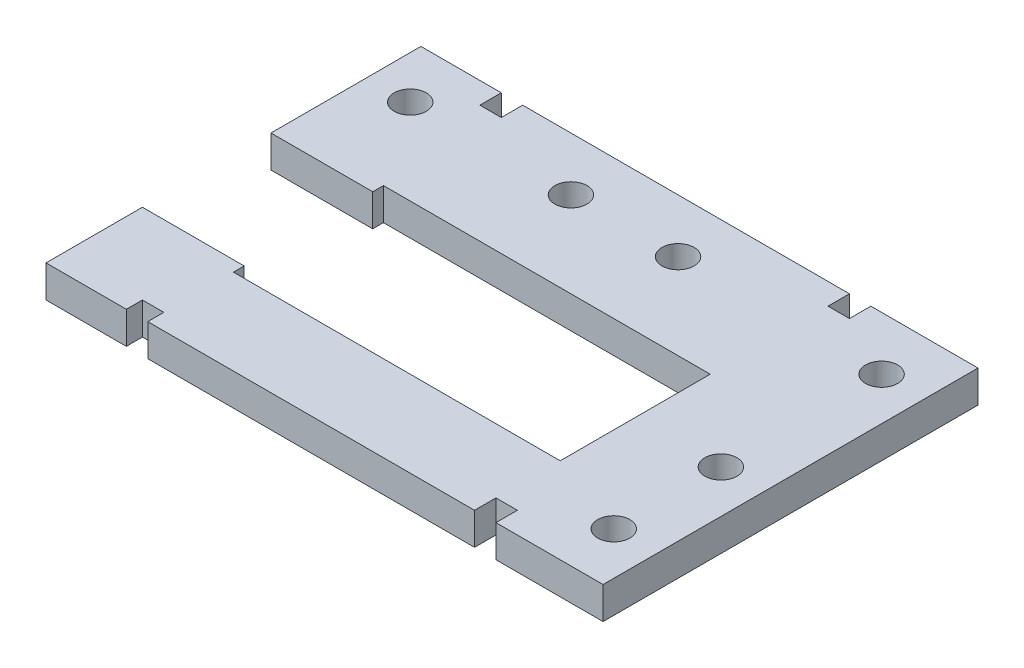
ISO-10303-21;
HEADER;
FILE_DESCRIPTION(('STEP AP214'),'2;1');
FILE_NAME('part.step','',(''),(''),'','','');
FILE_SCHEMA(('AUTOMOTIVE_DESIGN { 1 0 10303 214 1 1 1 1 }'));
ENDSEC;
DATA;
#1=APPLICATION_CONTEXT('core data for automotive mechanical design processes');
#2=APPLICATION_PROTOCOL_DEFINITION('international standard','automotive_design',2000,#1);
#3=PRODUCT_CONTEXT('',#1,'mechanical');
#4=PRODUCT('Part','Part','',(#3));
#5=PRODUCT_RELATED_PRODUCT_CATEGORY('part','',(#4));
#6=PRODUCT_DEFINITION_FORMATION('','',#4);
#7=PRODUCT_DEFINITION_CONTEXT('part definition',#1,'design');
#8=PRODUCT_DEFINITION('design','',#6,#7);
#9=PRODUCT_DEFINITION_SHAPE('','',#8);
#10=(LENGTH_UNIT() NAMED_UNIT(*) SI_UNIT(.MILLI.,.METRE.));
#11=(NAMED_UNIT(*) PLANE_ANGLE_UNIT() SI_UNIT($,.RADIAN.));
#12=(NAMED_UNIT(*) SI_UNIT($,.STERADIAN.) SOLID_ANGLE_UNIT());
#13=UNCERTAINTY_MEASURE_WITH_UNIT(LENGTH_MEASURE(1.E-05),#10,'distance_accuracy_value','');
#14=(GEOMETRIC_REPRESENTATION_CONTEXT(3) GLOBAL_UNCERTAINTY_ASSIGNED_CONTEXT((#13)) GLOBAL_UNIT_ASSIGNED_CONTEXT((#10,
#11,#12)) REPRESENTATION_CONTEXT('',''));
#15=CARTESIAN_POINT('',(0.,0.,0.));
#16=DIRECTION('',(0.,0.,1.));
#17=DIRECTION('',(1.,0.,0.));
#18=AXIS2_PLACEMENT_3D('',#15,#16,#17);
#19=CARTESIAN_POINT('',(0.,3.,-35.));
#20=DIRECTION('',(0.,0.,-1.));
#21=DIRECTION('',(-1.,0.,0.));
#22=AXIS2_PLACEMENT_3D('',#19,#20,#21);
#23=PLANE('',#22);
#24=DIRECTION('',(1.,0.,0.));
#25=VECTOR('',#24,1.);
#26=CARTESIAN_POINT('',(0.,0.,-35.));
#27=LINE('',#26,#25);
#28=CARTESIAN_POINT('',(42.,0.,-35.));
#29=VERTEX_POINT('',#28);
#30=CARTESIAN_POINT('',(52.,0.,-35.));
#31=VERTEX_POINT('',#30);
#32=EDGE_CURVE('E272',#29,#31,#27,.T.);
#33=ORIENTED_EDGE('',*,*,#32,.F.);
#34=DIRECTION('',(0.,-1.,0.));
#35=VECTOR('',#34,1.);
#36=CARTESIAN_POINT('',(42.,3.,-35.));
#37=LINE('',#36,#35);
#38=CARTESIAN_POINT('',(42.,3.,-35.));
#39=VERTEX_POINT('',#38);
#40=EDGE_CURVE('E11',#39,#29,#37,.T.);
#41=ORIENTED_EDGE('',*,*,#40,.F.);
#42=DIRECTION('',(1.,0.,0.));
#43=VECTOR('',#42,1.);
#44=CARTESIAN_POINT('',(0.,3.,-35.));
#45=LINE('',#44,#43);
#46=CARTESIAN_POINT('',(52.,3.,-35.));
#47=VERTEX_POINT('',#46);
#48=EDGE_CURVE('E418',#39,#47,#45,.T.);
#49=ORIENTED_EDGE('',*,*,#48,.T.);
#50=DIRECTION('',(0.,-1.,0.));
#51=VECTOR('',#50,1.);
#52=CARTESIAN_POINT('',(52.,3.,-35.));
#53=LINE('',#52,#51);
#54=EDGE_CURVE('E146',#47,#31,#53,.T.);
#55=ORIENTED_EDGE('',*,*,#54,.T.);
#56=EDGE_LOOP('',(#33,#41,#49,#55));
#57=FACE_BOUND('',#56,.T.);
#58=ADVANCED_FACE('F34',(#57),#23,.T.);
#59=CARTESIAN_POINT('',(42.,3.,0.));
#60=DIRECTION('',(1.,0.,0.));
#61=DIRECTION('',(0.,0.,-1.));
#62=AXIS2_PLACEMENT_3D('',#59,#60,#61);
#63=PLANE('',#62);
#64=DIRECTION('',(0.,0.,1.));
#65=VECTOR('',#64,1.);
#66=CARTESIAN_POINT('',(42.,0.,0.));
#67=LINE('',#66,#65);
#68=CARTESIAN_POINT('',(42.,0.,-33.));
#69=VERTEX_POINT('',#68);
#70=EDGE_CURVE('E274',#29,#69,#67,.T.);
#71=ORIENTED_EDGE('',*,*,#70,.T.);
#72=DIRECTION('',(0.,-1.,0.));
#73=VECTOR('',#72,1.);
#74=CARTESIAN_POINT('',(42.,3.,-33.));
#75=LINE('',#74,#73);
#76=CARTESIAN_POINT('',(42.,3.,-33.));
#77=VERTEX_POINT('',#76);
#78=EDGE_CURVE('E43',#77,#69,#75,.T.);
#79=ORIENTED_EDGE('',*,*,#78,.F.);
#80=DIRECTION('',(0.,0.,1.));
#81=VECTOR('',#80,1.);
#82=CARTESIAN_POINT('',(42.,3.,0.));
#83=LINE('',#82,#81);
#84=EDGE_CURVE('E414',#39,#77,#83,.T.);
#85=ORIENTED_EDGE('',*,*,#84,.F.);
#86=ORIENTED_EDGE('',*,*,#40,.T.);
#87=EDGE_LOOP('',(#71,#79,#85,#86));
#88=FACE_BOUND('',#87,.T.);
#89=ADVANCED_FACE('F401',(#88),#63,.F.);
#90=CARTESIAN_POINT('',(0.,3.,-33.));
#91=DIRECTION('',(0.,0.,-1.));
#92=DIRECTION('',(-1.,0.,0.));
#93=AXIS2_PLACEMENT_3D('',#90,#91,#92);
#94=PLANE('',#93);
#95=DIRECTION('',(1.,0.,0.));
#96=VECTOR('',#95,1.);
#97=CARTESIAN_POINT('',(0.,0.,-33.));
#98=LINE('',#97,#96);
#99=CARTESIAN_POINT('',(40.,0.,-33.));
#100=VERTEX_POINT('',#99);
#101=EDGE_CURVE('E279',#100,#69,#98,.T.);
#102=ORIENTED_EDGE('',*,*,#101,.F.);
#103=DIRECTION('',(0.,-1.,0.));
#104=VECTOR('',#103,1.);
#105=CARTESIAN_POINT('',(40.,3.,-33.));
#106=LINE('',#105,#104);
#107=CARTESIAN_POINT('',(40.,3.,-33.));
#108=VERTEX_POINT('',#107);
#109=EDGE_CURVE('E391',#108,#100,#106,.T.);
#110=ORIENTED_EDGE('',*,*,#109,.F.);
#111=DIRECTION('',(1.,0.,0.));
#112=VECTOR('',#111,1.);
#113=CARTESIAN_POINT('',(0.,3.,-33.));
#114=LINE('',#113,#112);
#115=EDGE_CURVE('E398',#108,#77,#114,.T.);
#116=ORIENTED_EDGE('',*,*,#115,.T.);
#117=ORIENTED_EDGE('',*,*,#78,.T.);
#118=EDGE_LOOP('',(#102,#110,#116,#117));
#119=FACE_BOUND('',#118,.T.);
#120=ADVANCED_FACE('F396',(#119),#94,.T.);
#121=CARTESIAN_POINT('',(40.,3.,0.));
#122=DIRECTION('',(1.,0.,0.));
#123=DIRECTION('',(0.,0.,-1.));
#124=AXIS2_PLACEMENT_3D('',#121,#122,#123);
#125=PLANE('',#124);
#126=DIRECTION('',(0.,0.,1.));
#127=VECTOR('',#126,1.);
#128=CARTESIAN_POINT('',(40.,0.,0.));
#129=LINE('',#128,#127);
#130=CARTESIAN_POINT('',(40.,0.,-35.));
#131=VERTEX_POINT('',#130);
#132=EDGE_CURVE('E282',#131,#100,#129,.T.);
#133=ORIENTED_EDGE('',*,*,#132,.F.);
#134=DIRECTION('',(0.,-1.,0.));
#135=VECTOR('',#134,1.);
#136=CARTESIAN_POINT('',(40.,3.,-35.));
#137=LINE('',#136,#135);
#138=CARTESIAN_POINT('',(40.,3.,-35.));
#139=VERTEX_POINT('',#138);
#140=EDGE_CURVE('E389',#139,#131,#137,.T.);
#141=ORIENTED_EDGE('',*,*,#140,.F.);
#142=DIRECTION('',(0.,0.,1.));
#143=VECTOR('',#142,1.);
#144=CARTESIAN_POINT('',(40.,3.,0.));
#145=LINE('',#144,#143);
#146=EDGE_CURVE('E411',#139,#108,#145,.T.);
#147=ORIENTED_EDGE('',*,*,#146,.T.);
#148=ORIENTED_EDGE('',*,*,#109,.T.);
#149=EDGE_LOOP('',(#133,#141,#147,#148));
#150=FACE_BOUND('',#149,.T.);
#151=ADVANCED_FACE('F408',(#150),#125,.T.);
#152=CARTESIAN_POINT('',(9.5,0.,-35.));
#153=VERTEX_POINT('',#152);
#154=EDGE_CURVE('E276',#153,#131,#27,.T.);
#155=ORIENTED_EDGE('',*,*,#154,.F.);
#156=DIRECTION('',(0.,-1.,0.));
#157=VECTOR('',#156,1.);
#158=CARTESIAN_POINT('',(9.5,3.,-35.));
#159=LINE('',#158,#157);
#160=CARTESIAN_POINT('',(9.5,3.,-35.));
#161=VERTEX_POINT('',#160);
#162=EDGE_CURVE('E387',#161,#153,#159,.T.);
#163=ORIENTED_EDGE('',*,*,#162,.F.);
#164=EDGE_CURVE('E416',#161,#139,#45,.T.);
#165=ORIENTED_EDGE('',*,*,#164,.T.);
#166=ORIENTED_EDGE('',*,*,#140,.T.);
#167=EDGE_LOOP('',(#155,#163,#165,#166));
#168=FACE_BOUND('',#167,.T.);
#169=ADVANCED_FACE('F544',(#168),#23,.T.);
#170=CARTESIAN_POINT('',(9.50000000000003,3.,0.));
#171=DIRECTION('',(1.,0.,0.));
#172=DIRECTION('',(0.,0.,-1.));
#173=AXIS2_PLACEMENT_3D('',#170,#171,#172);
#174=PLANE('',#173);
#175=DIRECTION('',(0.,0.,1.));
#176=VECTOR('',#175,1.);
#177=CARTESIAN_POINT('',(9.50000000000003,0.,0.));
#178=LINE('',#177,#176);
#179=CARTESIAN_POINT('',(9.5,0.,-33.));
#180=VERTEX_POINT('',#179);
#181=EDGE_CURVE('E285',#153,#180,#178,.T.);
#182=ORIENTED_EDGE('',*,*,#181,.T.);
#183=DIRECTION('',(0.,-1.,0.));
#184=VECTOR('',#183,1.);
#185=CARTESIAN_POINT('',(9.5,3.,-33.));
#186=LINE('',#185,#184);
#187=CARTESIAN_POINT('',(9.5,3.,-33.));
#188=VERTEX_POINT('',#187);
#189=EDGE_CURVE('E384',#188,#180,#186,.T.);
#190=ORIENTED_EDGE('',*,*,#189,.F.);
#191=DIRECTION('',(0.,0.,1.));
#192=VECTOR('',#191,1.);
#193=CARTESIAN_POINT('',(9.50000000000003,3.,0.));
#194=LINE('',#193,#192);
#195=EDGE_CURVE('E422',#161,#188,#194,.T.);
#196=ORIENTED_EDGE('',*,*,#195,.F.);
#197=ORIENTED_EDGE('',*,*,#162,.T.);
#198=EDGE_LOOP('',(#182,#190,#196,#197));
#199=FACE_BOUND('',#198,.T.);
#200=ADVANCED_FACE('F542',(#199),#174,.F.);
#201=CARTESIAN_POINT('',(0.,3.,-33.));
#202=DIRECTION('',(0.,0.,1.));
#203=DIRECTION('',(1.,0.,0.));
#204=AXIS2_PLACEMENT_3D('',#201,#202,#203);
#205=PLANE('',#204);
#206=DIRECTION('',(-1.,0.,0.));
#207=VECTOR('',#206,1.);
#208=CARTESIAN_POINT('',(0.,0.,-33.));
#209=LINE('',#208,#207);
#210=CARTESIAN_POINT('',(7.50000000000001,0.,-33.));
#211=VERTEX_POINT('',#210);
#212=EDGE_CURVE('E288',#180,#211,#209,.T.);
#213=ORIENTED_EDGE('',*,*,#212,.T.);
#214=DIRECTION('',(0.,-1.,0.));
#215=VECTOR('',#214,1.);
#216=CARTESIAN_POINT('',(7.50000000000001,3.,-33.));
#217=LINE('',#216,#215);
#218=CARTESIAN_POINT('',(7.50000000000001,3.,-33.));
#219=VERTEX_POINT('',#218);
#220=EDGE_CURVE('E382',#219,#211,#217,.T.);
#221=ORIENTED_EDGE('',*,*,#220,.F.);
#222=DIRECTION('',(-1.,0.,0.));
#223=VECTOR('',#222,1.);
#224=CARTESIAN_POINT('',(0.,3.,-33.));
#225=LINE('',#224,#223);
#226=EDGE_CURVE('E425',#188,#219,#225,.T.);
#227=ORIENTED_EDGE('',*,*,#226,.F.);
#228=ORIENTED_EDGE('',*,*,#189,.T.);
#229=EDGE_LOOP('',(#213,#221,#227,#228));
#230=FACE_BOUND('',#229,.T.);
#231=ADVANCED_FACE('F538',(#230),#205,.F.);
#232=CARTESIAN_POINT('',(7.50000000000002,3.,0.));
#233=DIRECTION('',(1.,0.,0.));
#234=DIRECTION('',(0.,0.,-1.));
#235=AXIS2_PLACEMENT_3D('',#232,#233,#234);
#236=PLANE('',#235);
#237=DIRECTION('',(0.,0.,1.));
#238=VECTOR('',#237,1.);
#239=CARTESIAN_POINT('',(7.50000000000002,0.,0.));
#240=LINE('',#239,#238);
#241=CARTESIAN_POINT('',(7.50000000000001,0.,-35.));
#242=VERTEX_POINT('',#241);
#243=EDGE_CURVE('E291',#242,#211,#240,.T.);
#244=ORIENTED_EDGE('',*,*,#243,.F.);
#245=DIRECTION('',(0.,-1.,0.));
#246=VECTOR('',#245,1.);
#247=CARTESIAN_POINT('',(7.50000000000001,3.,-35.));
#248=LINE('',#247,#246);
#249=CARTESIAN_POINT('',(7.50000000000001,3.,-35.));
#250=VERTEX_POINT('',#249);
#251=EDGE_CURVE('E380',#250,#242,#248,.T.);
#252=ORIENTED_EDGE('',*,*,#251,.F.);
#253=DIRECTION('',(0.,0.,1.));
#254=VECTOR('',#253,1.);
#255=CARTESIAN_POINT('',(7.50000000000002,3.,0.));
#256=LINE('',#255,#254);
#257=EDGE_CURVE('E427',#250,#219,#256,.T.);
#258=ORIENTED_EDGE('',*,*,#257,.T.);
#259=ORIENTED_EDGE('',*,*,#220,.T.);
#260=EDGE_LOOP('',(#244,#252,#258,#259));
#261=FACE_BOUND('',#260,.T.);
#262=ADVANCED_FACE('F534',(#261),#236,.T.);
#263=CARTESIAN_POINT('',(0.,0.,-35.));
#264=VERTEX_POINT('',#263);
#265=EDGE_CURVE('E275',#264,#242,#27,.T.);
#266=ORIENTED_EDGE('',*,*,#265,.F.);
#267=DIRECTION('',(0.,-1.,0.));
#268=VECTOR('',#267,1.);
#269=CARTESIAN_POINT('',(0.,3.,-35.));
#270=LINE('',#269,#268);
#271=CARTESIAN_POINT('',(0.,3.,-35.));
#272=VERTEX_POINT('',#271);
#273=EDGE_CURVE('E378',#272,#264,#270,.T.);
#274=ORIENTED_EDGE('',*,*,#273,.F.);
#275=EDGE_CURVE('E430',#272,#250,#45,.T.);
#276=ORIENTED_EDGE('',*,*,#275,.T.);
#277=ORIENTED_EDGE('',*,*,#251,.T.);
#278=EDGE_LOOP('',(#266,#274,#276,#277));
#279=FACE_BOUND('',#278,.T.);
#280=ADVANCED_FACE('F531',(#279),#23,.T.);
#281=CARTESIAN_POINT('',(0.,3.,0.));
#282=DIRECTION('',(-1.,0.,0.));
#283=DIRECTION('',(0.,0.,1.));
#284=AXIS2_PLACEMENT_3D('',#281,#282,#283);
#285=PLANE('',#284);
#286=DIRECTION('',(0.,0.,-1.));
#287=VECTOR('',#286,1.);
#288=CARTESIAN_POINT('',(0.,0.,0.));
#289=LINE('',#288,#287);
#290=CARTESIAN_POINT('',(0.,0.,-21.));
#291=VERTEX_POINT('',#290);
#292=EDGE_CURVE('E294',#291,#264,#289,.T.);
#293=ORIENTED_EDGE('',*,*,#292,.F.);
#294=DIRECTION('',(0.,-1.,0.));
#295=VECTOR('',#294,1.);
#296=CARTESIAN_POINT('',(0.,3.,-21.));
#297=LINE('',#296,#295);
#298=CARTESIAN_POINT('',(0.,3.,-21.));
#299=VERTEX_POINT('',#298);
#300=EDGE_CURVE('E376',#299,#291,#297,.T.);
#301=ORIENTED_EDGE('',*,*,#300,.F.);
#302=DIRECTION('',(0.,0.,-1.));
#303=VECTOR('',#302,1.);
#304=CARTESIAN_POINT('',(0.,3.,0.));
#305=LINE('',#304,#303);
#306=EDGE_CURVE('E431',#299,#272,#305,.T.);
#307=ORIENTED_EDGE('',*,*,#306,.T.);
#308=ORIENTED_EDGE('',*,*,#273,.T.);
#309=EDGE_LOOP('',(#293,#301,#307,#308));
#310=FACE_BOUND('',#309,.T.);
#311=ADVANCED_FACE('F524',(#310),#285,.T.);
#312=CARTESIAN_POINT('',(0.,3.,-21.));
#313=DIRECTION('',(0.,0.,-1.));
#314=DIRECTION('',(-1.,0.,0.));
#315=AXIS2_PLACEMENT_3D('',#312,#313,#314);
#316=PLANE('',#315);
#317=DIRECTION('',(1.,0.,0.));
#318=VECTOR('',#317,1.);
#319=CARTESIAN_POINT('',(0.,0.,-21.));
#320=LINE('',#319,#318);
#321=CARTESIAN_POINT('',(9.49999999999999,0.,-21.));
#322=VERTEX_POINT('',#321);
#323=EDGE_CURVE('E297',#291,#322,#320,.T.);
#324=ORIENTED_EDGE('',*,*,#323,.T.);
#325=DIRECTION('',(0.,-1.,0.));
#326=VECTOR('',#325,1.);
#327=CARTESIAN_POINT('',(9.49999999999999,3.,-21.));
#328=LINE('',#327,#326);
#329=CARTESIAN_POINT('',(9.49999999999999,3.,-21.));
#330=VERTEX_POINT('',#329);
#331=EDGE_CURVE('E374',#330,#322,#328,.T.);
#332=ORIENTED_EDGE('',*,*,#331,.F.);
#333=DIRECTION('',(1.,0.,0.));
#334=VECTOR('',#333,1.);
#335=CARTESIAN_POINT('',(0.,3.,-21.));
#336=LINE('',#335,#334);
#337=EDGE_CURVE('E434',#299,#330,#336,.T.);
#338=ORIENTED_EDGE('',*,*,#337,.F.);
#339=ORIENTED_EDGE('',*,*,#300,.T.);
#340=EDGE_LOOP('',(#324,#332,#338,#339));
#341=FACE_BOUND('',#340,.T.);
#342=ADVANCED_FACE('F547',(#341),#316,.F.);
#343=CARTESIAN_POINT('',(9.49999999999999,3.,0.));
#344=DIRECTION('',(1.,0.,0.));
#345=DIRECTION('',(0.,0.,-1.));
#346=AXIS2_PLACEMENT_3D('',#343,#344,#345);
#347=PLANE('',#346);
#348=DIRECTION('',(0.,0.,1.));
#349=VECTOR('',#348,1.);
#350=CARTESIAN_POINT('',(9.49999999999999,0.,0.));
#351=LINE('',#350,#349);
#352=CARTESIAN_POINT('',(9.49999999999999,0.,-22.));
#353=VERTEX_POINT('',#352);
#354=EDGE_CURVE('E301',#353,#322,#351,.T.);
#355=ORIENTED_EDGE('',*,*,#354,.F.);
#356=DIRECTION('',(0.,-1.,0.));
#357=VECTOR('',#356,1.);
#358=CARTESIAN_POINT('',(9.49999999999999,3.,-22.));
#359=LINE('',#358,#357);
#360=CARTESIAN_POINT('',(9.49999999999999,3.,-22.));
#361=VERTEX_POINT('',#360);
#362=EDGE_CURVE('E372',#361,#353,#359,.T.);
#363=ORIENTED_EDGE('',*,*,#362,.F.);
#364=DIRECTION('',(0.,0.,1.));
#365=VECTOR('',#364,1.);
#366=CARTESIAN_POINT('',(9.49999999999999,3.,0.));
#367=LINE('',#366,#365);
#368=EDGE_CURVE('E437',#361,#330,#367,.T.);
#369=ORIENTED_EDGE('',*,*,#368,.T.);
#370=ORIENTED_EDGE('',*,*,#331,.T.);
#371=EDGE_LOOP('',(#355,#363,#369,#370));
#372=FACE_BOUND('',#371,.T.);
#373=ADVANCED_FACE('F517',(#372),#347,.T.);
#374=CARTESIAN_POINT('',(0.,3.,-22.));
#375=DIRECTION('',(0.,0.,1.));
#376=DIRECTION('',(1.,0.,0.));
#377=AXIS2_PLACEMENT_3D('',#374,#375,#376);
#378=PLANE('',#377);
#379=DIRECTION('',(-1.,0.,0.));
#380=VECTOR('',#379,1.);
#381=CARTESIAN_POINT('',(0.,0.,-22.));
#382=LINE('',#381,#380);
#383=CARTESIAN_POINT('',(40.,0.,-22.));
#384=VERTEX_POINT('',#383);
#385=EDGE_CURVE('E304',#384,#353,#382,.T.);
#386=ORIENTED_EDGE('',*,*,#385,.F.);
#387=DIRECTION('',(0.,-1.,0.));
#388=VECTOR('',#387,1.);
#389=CARTESIAN_POINT('',(40.,3.,-22.));
#390=LINE('',#389,#388);
#391=CARTESIAN_POINT('',(40.,3.,-22.));
#392=VERTEX_POINT('',#391);
#393=EDGE_CURVE('E370',#392,#384,#390,.T.);
#394=ORIENTED_EDGE('',*,*,#393,.F.);
#395=DIRECTION('',(-1.,0.,0.));
#396=VECTOR('',#395,1.);
#397=CARTESIAN_POINT('',(0.,3.,-22.));
#398=LINE('',#397,#396);
#399=EDGE_CURVE('E440',#392,#361,#398,.T.);
#400=ORIENTED_EDGE('',*,*,#399,.T.);
#401=ORIENTED_EDGE('',*,*,#362,.T.);
#402=EDGE_LOOP('',(#386,#394,#400,#401));
#403=FACE_BOUND('',#402,.T.);
#404=ADVANCED_FACE('F511',(#403),#378,.T.);
#405=CARTESIAN_POINT('',(40.,3.,0.));
#406=DIRECTION('',(1.,0.,0.));
#407=DIRECTION('',(0.,0.,-1.));
#408=AXIS2_PLACEMENT_3D('',#405,#406,#407);
#409=PLANE('',#408);
#410=DIRECTION('',(0.,0.,1.));
#411=VECTOR('',#410,1.);
#412=CARTESIAN_POINT('',(40.,0.,0.));
#413=LINE('',#412,#411);
#414=CARTESIAN_POINT('',(40.,0.,-8.));
#415=VERTEX_POINT('',#414);
#416=EDGE_CURVE('E308',#384,#415,#413,.T.);
#417=ORIENTED_EDGE('',*,*,#416,.T.);
#418=DIRECTION('',(0.,-1.,0.));
#419=VECTOR('',#418,1.);
#420=CARTESIAN_POINT('',(40.,3.,-8.));
#421=LINE('',#420,#419);
#422=CARTESIAN_POINT('',(40.,3.,-8.));
#423=VERTEX_POINT('',#422);
#424=EDGE_CURVE('E367',#423,#415,#421,.T.);
#425=ORIENTED_EDGE('',*,*,#424,.F.);
#426=DIRECTION('',(0.,0.,1.));
#427=VECTOR('',#426,1.);
#428=CARTESIAN_POINT('',(40.,3.,0.));
#429=LINE('',#428,#427);
#430=EDGE_CURVE('E444',#392,#423,#429,.T.);
#431=ORIENTED_EDGE('',*,*,#430,.F.);
#432=ORIENTED_EDGE('',*,*,#393,.T.);
#433=EDGE_LOOP('',(#417,#425,#431,#432));
#434=FACE_BOUND('',#433,.T.);
#435=ADVANCED_FACE('F653',(#434),#409,.F.);
#436=CARTESIAN_POINT('',(0.,3.,-7.99999999999999));
#437=DIRECTION('',(0.,0.,1.));
#438=DIRECTION('',(1.,0.,0.));
#439=AXIS2_PLACEMENT_3D('',#436,#437,#438);
#440=PLANE('',#439);
#441=DIRECTION('',(-1.,0.,0.));
#442=VECTOR('',#441,1.);
#443=CARTESIAN_POINT('',(0.,0.,-7.99999999999999));
#444=LINE('',#443,#442);
#445=CARTESIAN_POINT('',(9.49999999999999,0.,-7.99999999999999));
#446=VERTEX_POINT('',#445);
#447=EDGE_CURVE('E311',#415,#446,#444,.T.);
#448=ORIENTED_EDGE('',*,*,#447,.T.);
#449=DIRECTION('',(0.,-1.,0.));
#450=VECTOR('',#449,1.);
#451=CARTESIAN_POINT('',(9.49999999999999,3.,-7.99999999999999));
#452=LINE('',#451,#450);
#453=CARTESIAN_POINT('',(9.49999999999999,3.,-7.99999999999999));
#454=VERTEX_POINT('',#453);
#455=EDGE_CURVE('E365',#454,#446,#452,.T.);
#456=ORIENTED_EDGE('',*,*,#455,.F.);
#457=DIRECTION('',(-1.,0.,0.));
#458=VECTOR('',#457,1.);
#459=CARTESIAN_POINT('',(0.,3.,-7.99999999999999));
#460=LINE('',#459,#458);
#461=EDGE_CURVE('E447',#423,#454,#460,.T.);
#462=ORIENTED_EDGE('',*,*,#461,.F.);
#463=ORIENTED_EDGE('',*,*,#424,.T.);
#464=EDGE_LOOP('',(#448,#456,#462,#463));
#465=FACE_BOUND('',#464,.T.);
#466=ADVANCED_FACE('F505',(#465),#440,.F.);
#467=CARTESIAN_POINT('',(9.49999999999999,0.,-9.));
#468=VERTEX_POINT('',#467);
#469=EDGE_CURVE('E305',#468,#446,#351,.T.);
#470=ORIENTED_EDGE('',*,*,#469,.F.);
#471=DIRECTION('',(0.,-1.,0.));
#472=VECTOR('',#471,1.);
#473=CARTESIAN_POINT('',(9.49999999999999,3.,-9.));
#474=LINE('',#473,#472);
#475=CARTESIAN_POINT('',(9.49999999999999,3.,-9.));
#476=VERTEX_POINT('',#475);
#477=EDGE_CURVE('E363',#476,#468,#474,.T.);
#478=ORIENTED_EDGE('',*,*,#477,.F.);
#479=EDGE_CURVE('E441',#476,#454,#367,.T.);
#480=ORIENTED_EDGE('',*,*,#479,.T.);
#481=ORIENTED_EDGE('',*,*,#455,.T.);
#482=EDGE_LOOP('',(#470,#478,#480,#481));
#483=FACE_BOUND('',#482,.T.);
#484=ADVANCED_FACE('F502',(#483),#347,.T.);
#485=CARTESIAN_POINT('',(0.,3.,-9.));
#486=DIRECTION('',(0.,0.,-1.));
#487=DIRECTION('',(-1.,0.,0.));
#488=AXIS2_PLACEMENT_3D('',#485,#486,#487);
#489=PLANE('',#488);
#490=DIRECTION('',(1.,0.,0.));
#491=VECTOR('',#490,1.);
#492=CARTESIAN_POINT('',(0.,0.,-9.));
#493=LINE('',#492,#491);
#494=CARTESIAN_POINT('',(0.,0.,-9.));
#495=VERTEX_POINT('',#494);
#496=EDGE_CURVE('E314',#495,#468,#493,.T.);
#497=ORIENTED_EDGE('',*,*,#496,.F.);
#498=DIRECTION('',(0.,-1.,0.));
#499=VECTOR('',#498,1.);
#500=CARTESIAN_POINT('',(0.,3.,-9.));
#501=LINE('',#500,#499);
#502=CARTESIAN_POINT('',(0.,3.,-9.));
#503=VERTEX_POINT('',#502);
#504=EDGE_CURVE('E361',#503,#495,#501,.T.);
#505=ORIENTED_EDGE('',*,*,#504,.F.);
#506=DIRECTION('',(1.,0.,0.));
#507=VECTOR('',#506,1.);
#508=CARTESIAN_POINT('',(0.,3.,-9.));
#509=LINE('',#508,#507);
#510=EDGE_CURVE('E449',#503,#476,#509,.T.);
#511=ORIENTED_EDGE('',*,*,#510,.T.);
#512=ORIENTED_EDGE('',*,*,#477,.T.);
#513=EDGE_LOOP('',(#497,#505,#511,#512));
#514=FACE_BOUND('',#513,.T.);
#515=ADVANCED_FACE('F497',(#514),#489,.T.);
#516=CARTESIAN_POINT('',(0.,0.,0.));
#517=VERTEX_POINT('',#516);
#518=EDGE_CURVE('E298',#517,#495,#289,.T.);
#519=ORIENTED_EDGE('',*,*,#518,.F.);
#520=DIRECTION('',(0.,-1.,0.));
#521=VECTOR('',#520,1.);
#522=CARTESIAN_POINT('',(0.,3.,0.));
#523=LINE('',#522,#521);
#524=CARTESIAN_POINT('',(0.,3.,0.));
#525=VERTEX_POINT('',#524);
#526=EDGE_CURVE('E359',#525,#517,#523,.T.);
#527=ORIENTED_EDGE('',*,*,#526,.F.);
#528=EDGE_CURVE('E435',#525,#503,#305,.T.);
#529=ORIENTED_EDGE('',*,*,#528,.T.);
#530=ORIENTED_EDGE('',*,*,#504,.T.);
#531=EDGE_LOOP('',(#519,#527,#529,#530));
#532=FACE_BOUND('',#531,.T.);
#533=ADVANCED_FACE('F492',(#532),#285,.T.);
#534=CARTESIAN_POINT('',(0.,3.,0.));
#535=DIRECTION('',(0.,0.,-1.));
#536=DIRECTION('',(-1.,0.,0.));
#537=AXIS2_PLACEMENT_3D('',#534,#535,#536);
#538=PLANE('',#537);
#539=DIRECTION('',(1.,0.,0.));
#540=VECTOR('',#539,1.);
#541=CARTESIAN_POINT('',(0.,0.,0.));
#542=LINE('',#541,#540);
#543=CARTESIAN_POINT('',(7.50000000000001,0.,0.));
#544=VERTEX_POINT('',#543);
#545=EDGE_CURVE('E317',#517,#544,#542,.T.);
#546=ORIENTED_EDGE('',*,*,#545,.T.);
#547=DIRECTION('',(0.,-1.,0.));
#548=VECTOR('',#547,1.);
#549=CARTESIAN_POINT('',(7.50000000000001,3.,0.));
#550=LINE('',#549,#548);
#551=CARTESIAN_POINT('',(7.50000000000001,3.,0.));
#552=VERTEX_POINT('',#551);
#553=EDGE_CURVE('E356',#552,#544,#550,.T.);
#554=ORIENTED_EDGE('',*,*,#553,.F.);
#555=DIRECTION('',(1.,0.,0.));
#556=VECTOR('',#555,1.);
#557=CARTESIAN_POINT('',(0.,3.,0.));
#558=LINE('',#557,#556);
#559=EDGE_CURVE('E243',#525,#552,#558,.T.);
#560=ORIENTED_EDGE('',*,*,#559,.F.);
#561=ORIENTED_EDGE('',*,*,#526,.T.);
#562=EDGE_LOOP('',(#546,#554,#560,#561));
#563=FACE_BOUND('',#562,.T.);
#564=ADVANCED_FACE('F488',(#563),#538,.F.);
#565=CARTESIAN_POINT('',(7.50000000000001,3.,0.));
#566=DIRECTION('',(-1.,0.,0.));
#567=DIRECTION('',(0.,0.,1.));
#568=AXIS2_PLACEMENT_3D('',#565,#566,#567);
#569=PLANE('',#568);
#570=DIRECTION('',(0.,0.,-1.));
#571=VECTOR('',#570,1.);
#572=CARTESIAN_POINT('',(7.50000000000001,0.,0.));
#573=LINE('',#572,#571);
#574=CARTESIAN_POINT('',(7.50000000000001,0.,-1.5));
#575=VERTEX_POINT('',#574);
#576=EDGE_CURVE('E320',#544,#575,#573,.T.);
#577=ORIENTED_EDGE('',*,*,#576,.T.);
#578=DIRECTION('',(0.,-1.,0.));
#579=VECTOR('',#578,1.);
#580=CARTESIAN_POINT('',(7.50000000000001,3.,-1.5));
#581=LINE('',#580,#579);
#582=CARTESIAN_POINT('',(7.50000000000001,3.,-1.5));
#583=VERTEX_POINT('',#582);
#584=EDGE_CURVE('E353',#583,#575,#581,.T.);
#585=ORIENTED_EDGE('',*,*,#584,.F.);
#586=DIRECTION('',(0.,0.,-1.));
#587=VECTOR('',#586,1.);
#588=CARTESIAN_POINT('',(7.50000000000001,3.,0.));
#589=LINE('',#588,#587);
#590=EDGE_CURVE('E453',#552,#583,#589,.T.);
#591=ORIENTED_EDGE('',*,*,#590,.F.);
#592=ORIENTED_EDGE('',*,*,#553,.T.);
#593=EDGE_LOOP('',(#577,#585,#591,#592));
#594=FACE_BOUND('',#593,.T.);
#595=ADVANCED_FACE('F485',(#594),#569,.F.);
#596=CARTESIAN_POINT('',(0.,3.,-1.5));
#597=DIRECTION('',(0.,0.,-1.));
#598=DIRECTION('',(-1.,0.,0.));
#599=AXIS2_PLACEMENT_3D('',#596,#597,#598);
#600=PLANE('',#599);
#601=DIRECTION('',(1.,0.,0.));
#602=VECTOR('',#601,1.);
#603=CARTESIAN_POINT('',(0.,0.,-1.5));
#604=LINE('',#603,#602);
#605=CARTESIAN_POINT('',(9.50000000000001,0.,-1.5));
#606=VERTEX_POINT('',#605);
#607=EDGE_CURVE('E325',#575,#606,#604,.T.);
#608=ORIENTED_EDGE('',*,*,#607,.T.);
#609=DIRECTION('',(0.,-1.,0.));
#610=VECTOR('',#609,1.);
#611=CARTESIAN_POINT('',(9.50000000000001,3.,-1.5));
#612=LINE('',#611,#610);
#613=CARTESIAN_POINT('',(9.50000000000001,3.,-1.5));
#614=VERTEX_POINT('',#613);
#615=EDGE_CURVE('E351',#614,#606,#612,.T.);
#616=ORIENTED_EDGE('',*,*,#615,.F.);
#617=DIRECTION('',(1.,0.,0.));
#618=VECTOR('',#617,1.);
#619=CARTESIAN_POINT('',(0.,3.,-1.5));
#620=LINE('',#619,#618);
#621=EDGE_CURVE('E456',#583,#614,#620,.T.);
#622=ORIENTED_EDGE('',*,*,#621,.F.);
#623=ORIENTED_EDGE('',*,*,#584,.T.);
#624=EDGE_LOOP('',(#608,#616,#622,#623));
#625=FACE_BOUND('',#624,.T.);
#626=ADVANCED_FACE('F478',(#625),#600,.F.);
#627=CARTESIAN_POINT('',(9.50000000000001,3.,0.));
#628=DIRECTION('',(-1.,0.,0.));
#629=DIRECTION('',(0.,0.,1.));
#630=AXIS2_PLACEMENT_3D('',#627,#628,#629);
#631=PLANE('',#630);
#632=DIRECTION('',(0.,0.,-1.));
#633=VECTOR('',#632,1.);
#634=CARTESIAN_POINT('',(9.50000000000001,0.,0.));
#635=LINE('',#634,#633);
#636=CARTESIAN_POINT('',(9.50000000000001,0.,0.));
#637=VERTEX_POINT('',#636);
#638=EDGE_CURVE('E328',#637,#606,#635,.T.);
#639=ORIENTED_EDGE('',*,*,#638,.F.);
#640=DIRECTION('',(0.,-1.,0.));
#641=VECTOR('',#640,1.);
#642=CARTESIAN_POINT('',(9.50000000000001,3.,0.));
#643=LINE('',#642,#641);
#644=CARTESIAN_POINT('',(9.50000000000001,3.,0.));
#645=VERTEX_POINT('',#644);
#646=EDGE_CURVE('E349',#645,#637,#643,.T.);
#647=ORIENTED_EDGE('',*,*,#646,.F.);
#648=DIRECTION('',(0.,0.,-1.));
#649=VECTOR('',#648,1.);
#650=CARTESIAN_POINT('',(9.50000000000001,3.,0.));
#651=LINE('',#650,#649);
#652=EDGE_CURVE('E458',#645,#614,#651,.T.);
#653=ORIENTED_EDGE('',*,*,#652,.T.);
#654=ORIENTED_EDGE('',*,*,#615,.T.);
#655=EDGE_LOOP('',(#639,#647,#653,#654));
#656=FACE_BOUND('',#655,.T.);
#657=ADVANCED_FACE('F475',(#656),#631,.T.);
#658=CARTESIAN_POINT('',(40.,0.,0.));
#659=VERTEX_POINT('',#658);
#660=EDGE_CURVE('E322',#637,#659,#542,.T.);
#661=ORIENTED_EDGE('',*,*,#660,.T.);
#662=DIRECTION('',(0.,-1.,0.));
#663=VECTOR('',#662,1.);
#664=CARTESIAN_POINT('',(40.,3.,0.));
#665=LINE('',#664,#663);
#666=CARTESIAN_POINT('',(40.,3.,0.));
#667=VERTEX_POINT('',#666);
#668=EDGE_CURVE('E346',#667,#659,#665,.T.);
#669=ORIENTED_EDGE('',*,*,#668,.F.);
#670=EDGE_CURVE('E242',#645,#667,#558,.T.);
#671=ORIENTED_EDGE('',*,*,#670,.F.);
#672=ORIENTED_EDGE('',*,*,#646,.T.);
#673=EDGE_LOOP('',(#661,#669,#671,#672));
#674=FACE_BOUND('',#673,.T.);
#675=ADVANCED_FACE('F467',(#674),#538,.F.);
#676=CARTESIAN_POINT('',(40.,3.,0.));
#677=DIRECTION('',(-1.,0.,0.));
#678=DIRECTION('',(0.,0.,1.));
#679=AXIS2_PLACEMENT_3D('',#676,#677,#678);
#680=PLANE('',#679);
#681=DIRECTION('',(0.,0.,-1.));
#682=VECTOR('',#681,1.);
#683=CARTESIAN_POINT('',(40.,0.,0.));
#684=LINE('',#683,#682);
#685=CARTESIAN_POINT('',(40.,0.,-2.));
#686=VERTEX_POINT('',#685);
#687=EDGE_CURVE('E331',#659,#686,#684,.T.);
#688=ORIENTED_EDGE('',*,*,#687,.T.);
#689=DIRECTION('',(0.,-1.,0.));
#690=VECTOR('',#689,1.);
#691=CARTESIAN_POINT('',(40.,3.,-2.));
#692=LINE('',#691,#690);
#693=CARTESIAN_POINT('',(40.,3.,-2.));
#694=VERTEX_POINT('',#693);
#695=EDGE_CURVE('E343',#694,#686,#692,.T.);
#696=ORIENTED_EDGE('',*,*,#695,.F.);
#697=DIRECTION('',(0.,0.,-1.));
#698=VECTOR('',#697,1.);
#699=CARTESIAN_POINT('',(40.,3.,0.));
#700=LINE('',#699,#698);
#701=EDGE_CURVE('E249',#667,#694,#700,.T.);
#702=ORIENTED_EDGE('',*,*,#701,.F.);
#703=ORIENTED_EDGE('',*,*,#668,.T.);
#704=EDGE_LOOP('',(#688,#696,#702,#703));
#705=FACE_BOUND('',#704,.T.);
#706=ADVANCED_FACE('F470',(#705),#680,.F.);
#707=CARTESIAN_POINT('',(0.,3.,-2.));
#708=DIRECTION('',(0.,0.,-1.));
#709=DIRECTION('',(-1.,0.,0.));
#710=AXIS2_PLACEMENT_3D('',#707,#708,#709);
#711=PLANE('',#710);
#712=DIRECTION('',(1.,0.,0.));
#713=VECTOR('',#712,1.);
#714=CARTESIAN_POINT('',(0.,0.,-2.));
#715=LINE('',#714,#713);
#716=CARTESIAN_POINT('',(42.,0.,-2.));
#717=VERTEX_POINT('',#716);
#718=EDGE_CURVE('E334',#686,#717,#715,.T.);
#719=ORIENTED_EDGE('',*,*,#718,.T.);
#720=DIRECTION('',(0.,-1.,0.));
#721=VECTOR('',#720,1.);
#722=CARTESIAN_POINT('',(42.,3.,-2.));
#723=LINE('',#722,#721);
#724=CARTESIAN_POINT('',(42.,3.,-2.));
#725=VERTEX_POINT('',#724);
#726=EDGE_CURVE('E235',#725,#717,#723,.T.);
#727=ORIENTED_EDGE('',*,*,#726,.F.);
#728=DIRECTION('',(1.,0.,0.));
#729=VECTOR('',#728,1.);
#730=CARTESIAN_POINT('',(0.,3.,-2.));
#731=LINE('',#730,#729);
#732=EDGE_CURVE('E246',#694,#725,#731,.T.);
#733=ORIENTED_EDGE('',*,*,#732,.F.);
#734=ORIENTED_EDGE('',*,*,#695,.T.);
#735=EDGE_LOOP('',(#719,#727,#733,#734));
#736=FACE_BOUND('',#735,.T.);
#737=ADVANCED_FACE('F472',(#736),#711,.F.);
#738=CARTESIAN_POINT('',(42.,3.,0.));
#739=DIRECTION('',(-1.,0.,0.));
#740=DIRECTION('',(0.,0.,1.));
#741=AXIS2_PLACEMENT_3D('',#738,#739,#740);
#742=PLANE('',#741);
#743=DIRECTION('',(0.,0.,-1.));
#744=VECTOR('',#743,1.);
#745=CARTESIAN_POINT('',(42.,0.,0.));
#746=LINE('',#745,#744);
#747=CARTESIAN_POINT('',(42.,0.,0.));
#748=VERTEX_POINT('',#747);
#749=EDGE_CURVE('E232',#748,#717,#746,.T.);
#750=ORIENTED_EDGE('',*,*,#749,.F.);
#751=DIRECTION('',(0.,-1.,0.));
#752=VECTOR('',#751,1.);
#753=CARTESIAN_POINT('',(42.,3.,0.));
#754=LINE('',#753,#752);
#755=CARTESIAN_POINT('',(42.,3.,0.));
#756=VERTEX_POINT('',#755);
#757=EDGE_CURVE('E226',#756,#748,#754,.T.);
#758=ORIENTED_EDGE('',*,*,#757,.F.);
#759=DIRECTION('',(0.,0.,-1.));
#760=VECTOR('',#759,1.);
#761=CARTESIAN_POINT('',(42.,3.,0.));
#762=LINE('',#761,#760);
#763=EDGE_CURVE('E230',#756,#725,#762,.T.);
#764=ORIENTED_EDGE('',*,*,#763,.T.);
#765=ORIENTED_EDGE('',*,*,#726,.T.);
#766=EDGE_LOOP('',(#750,#758,#764,#765));
#767=FACE_BOUND('',#766,.T.);
#768=ADVANCED_FACE('F228',(#767),#742,.T.);
#769=CARTESIAN_POINT('',(52.,0.,0.));
#770=VERTEX_POINT('',#769);
#771=EDGE_CURVE('E321',#748,#770,#542,.T.);
#772=ORIENTED_EDGE('',*,*,#771,.T.);
#773=DIRECTION('',(0.,-1.,0.));
#774=VECTOR('',#773,1.);
#775=CARTESIAN_POINT('',(52.,3.,0.));
#776=LINE('',#775,#774);
#777=CARTESIAN_POINT('',(52.,3.,0.));
#778=VERTEX_POINT('',#777);
#779=EDGE_CURVE('E236',#778,#770,#776,.T.);
#780=ORIENTED_EDGE('',*,*,#779,.F.);
#781=EDGE_CURVE('E239',#756,#778,#558,.T.);
#782=ORIENTED_EDGE('',*,*,#781,.F.);
#783=ORIENTED_EDGE('',*,*,#757,.T.);
#784=EDGE_LOOP('',(#772,#780,#782,#783));
#785=FACE_BOUND('',#784,.T.);
#786=ADVANCED_FACE('F240',(#785),#538,.F.);
#787=CARTESIAN_POINT('',(4.,3.,-30.));
#788=DIRECTION('',(0.,-1.,0.));
#789=DIRECTION('',(0.,0.,-1.));
#790=AXIS2_PLACEMENT_3D('',#787,#788,#789);
#791=CYLINDRICAL_SURFACE('',#790,1.5);
#792=CARTESIAN_POINT('',(4.,3.,-30.));
#793=DIRECTION('',(0.,1.,0.));
#794=DIRECTION('',(0.,0.,1.));
#795=AXIS2_PLACEMENT_3D('',#792,#793,#794);
#796=CIRCLE('',#795,1.5);
#797=CARTESIAN_POINT('',(4.,3.,-28.5));
#798=VERTEX_POINT('',#797);
#799=EDGE_CURVE('E546',#798,#798,#796,.T.);
#800=ORIENTED_EDGE('',*,*,#799,.T.);
#801=EDGE_LOOP('',(#800));
#802=FACE_BOUND('',#801,.T.);
#803=CARTESIAN_POINT('',(4.,0.,-30.));
#804=DIRECTION('',(0.,1.,0.));
#805=DIRECTION('',(0.,0.,1.));
#806=AXIS2_PLACEMENT_3D('',#803,#804,#805);
#807=CIRCLE('',#806,1.5);
#808=CARTESIAN_POINT('',(4.,0.,-28.5));
#809=VERTEX_POINT('',#808);
#810=EDGE_CURVE('E269',#809,#809,#807,.T.);
#811=ORIENTED_EDGE('',*,*,#810,.F.);
#812=EDGE_LOOP('',(#811));
#813=FACE_BOUND('',#812,.T.);
#814=ADVANCED_FACE('F580',(#802,#813),#791,.F.);
#815=CARTESIAN_POINT('',(48.,3.,-30.));
#816=DIRECTION('',(0.,-1.,0.));
#817=DIRECTION('',(0.,0.,-1.));
#818=AXIS2_PLACEMENT_3D('',#815,#816,#817);
#819=CYLINDRICAL_SURFACE('',#818,1.5);
#820=CARTESIAN_POINT('',(48.,3.,-30.));
#821=DIRECTION('',(0.,1.,0.));
#822=DIRECTION('',(0.,0.,1.));
#823=AXIS2_PLACEMENT_3D('',#820,#821,#822);
#824=CIRCLE('',#823,1.5);
#825=CARTESIAN_POINT('',(48.,3.,-28.5));
#826=VERTEX_POINT('',#825);
#827=EDGE_CURVE('E879',#826,#826,#824,.T.);
#828=ORIENTED_EDGE('',*,*,#827,.T.);
#829=EDGE_LOOP('',(#828));
#830=FACE_BOUND('',#829,.T.);
#831=CARTESIAN_POINT('',(48.,0.,-30.));
#832=DIRECTION('',(0.,1.,0.));
#833=DIRECTION('',(0.,0.,1.));
#834=AXIS2_PLACEMENT_3D('',#831,#832,#833);
#835=CIRCLE('',#834,1.5);
#836=CARTESIAN_POINT('',(48.,0.,-28.5));
#837=VERTEX_POINT('',#836);
#838=EDGE_CURVE('E266',#837,#837,#835,.T.);
#839=ORIENTED_EDGE('',*,*,#838,.F.);
#840=EDGE_LOOP('',(#839));
#841=FACE_BOUND('',#840,.T.);
#842=ADVANCED_FACE('F583',(#830,#841),#819,.F.);
#843=CARTESIAN_POINT('',(19.,3.,-30.));
#844=DIRECTION('',(0.,-1.,0.));
#845=DIRECTION('',(0.,0.,-1.));
#846=AXIS2_PLACEMENT_3D('',#843,#844,#845);
#847=CYLINDRICAL_SURFACE('',#846,1.5);
#848=CARTESIAN_POINT('',(19.,3.,-30.));
#849=DIRECTION('',(0.,1.,0.));
#850=DIRECTION('',(0.,0.,1.));
#851=AXIS2_PLACEMENT_3D('',#848,#849,#850);
#852=CIRCLE('',#851,1.5);
#853=CARTESIAN_POINT('',(19.,3.,-28.5));
#854=VERTEX_POINT('',#853);
#855=EDGE_CURVE('E875',#854,#854,#852,.T.);
#856=ORIENTED_EDGE('',*,*,#855,.T.);
#857=EDGE_LOOP('',(#856));
#858=FACE_BOUND('',#857,.T.);
#859=CARTESIAN_POINT('',(19.,0.,-30.));
#860=DIRECTION('',(0.,1.,0.));
#861=DIRECTION('',(0.,0.,1.));
#862=AXIS2_PLACEMENT_3D('',#859,#860,#861);
#863=CIRCLE('',#862,1.5);
#864=CARTESIAN_POINT('',(19.,0.,-28.5));
#865=VERTEX_POINT('',#864);
#866=EDGE_CURVE('E263',#865,#865,#863,.T.);
#867=ORIENTED_EDGE('',*,*,#866,.F.);
#868=EDGE_LOOP('',(#867));
#869=FACE_BOUND('',#868,.T.);
#870=ADVANCED_FACE('F587',(#858,#869),#847,.F.);
#871=CARTESIAN_POINT('',(29.,3.,-30.));
#872=DIRECTION('',(0.,-1.,0.));
#873=DIRECTION('',(0.,0.,-1.));
#874=AXIS2_PLACEMENT_3D('',#871,#872,#873);
#875=CYLINDRICAL_SURFACE('',#874,1.5);
#876=CARTESIAN_POINT('',(29.,3.,-30.));
#877=DIRECTION('',(0.,1.,0.));
#878=DIRECTION('',(0.,0.,1.));
#879=AXIS2_PLACEMENT_3D('',#876,#877,#878);
#880=CIRCLE('',#879,1.5);
#881=CARTESIAN_POINT('',(29.,3.,-28.5));
#882=VERTEX_POINT('',#881);
#883=EDGE_CURVE('E871',#882,#882,#880,.T.);
#884=ORIENTED_EDGE('',*,*,#883,.T.);
#885=EDGE_LOOP('',(#884));
#886=FACE_BOUND('',#885,.T.);
#887=CARTESIAN_POINT('',(29.,0.,-30.));
#888=DIRECTION('',(0.,1.,0.));
#889=DIRECTION('',(0.,0.,1.));
#890=AXIS2_PLACEMENT_3D('',#887,#888,#889);
#891=CIRCLE('',#890,1.5);
#892=CARTESIAN_POINT('',(29.,0.,-28.5));
#893=VERTEX_POINT('',#892);
#894=EDGE_CURVE('E260',#893,#893,#891,.T.);
#895=ORIENTED_EDGE('',*,*,#894,.F.);
#896=EDGE_LOOP('',(#895));
#897=FACE_BOUND('',#896,.T.);
#898=ADVANCED_FACE('F591',(#886,#897),#875,.F.);
#899=CARTESIAN_POINT('',(48.,3.,-15.));
#900=DIRECTION('',(0.,-1.,0.));
#901=DIRECTION('',(0.,0.,-1.));
#902=AXIS2_PLACEMENT_3D('',#899,#900,#901);
#903=CYLINDRICAL_SURFACE('',#902,1.5);
#904=CARTESIAN_POINT('',(48.,3.,-15.));
#905=DIRECTION('',(0.,1.,0.));
#906=DIRECTION('',(0.,0.,1.));
#907=AXIS2_PLACEMENT_3D('',#904,#905,#906);
#908=CIRCLE('',#907,1.5);
#909=CARTESIAN_POINT('',(48.,3.,-13.5));
#910=VERTEX_POINT('',#909);
#911=EDGE_CURVE('E606',#910,#910,#908,.T.);
#912=ORIENTED_EDGE('',*,*,#911,.T.);
#913=EDGE_LOOP('',(#912));
#914=FACE_BOUND('',#913,.T.);
#915=CARTESIAN_POINT('',(48.,0.,-15.));
#916=DIRECTION('',(0.,1.,0.));
#917=DIRECTION('',(0.,0.,1.));
#918=AXIS2_PLACEMENT_3D('',#915,#916,#917);
#919=CIRCLE('',#918,1.5);
#920=CARTESIAN_POINT('',(48.,0.,-13.5));
#921=VERTEX_POINT('',#920);
#922=EDGE_CURVE('E257',#921,#921,#919,.T.);
#923=ORIENTED_EDGE('',*,*,#922,.F.);
#924=EDGE_LOOP('',(#923));
#925=FACE_BOUND('',#924,.T.);
#926=ADVANCED_FACE('F594',(#914,#925),#903,.F.);
#927=CARTESIAN_POINT('',(48.,3.,-5.));
#928=DIRECTION('',(0.,-1.,0.));
#929=DIRECTION('',(0.,0.,-1.));
#930=AXIS2_PLACEMENT_3D('',#927,#928,#929);
#931=CYLINDRICAL_SURFACE('',#930,1.5);
#932=CARTESIAN_POINT('',(48.,3.,-5.));
#933=DIRECTION('',(0.,1.,0.));
#934=DIRECTION('',(0.,0.,1.));
#935=AXIS2_PLACEMENT_3D('',#932,#933,#934);
#936=CIRCLE('',#935,1.5);
#937=CARTESIAN_POINT('',(48.,3.,-3.5));
#938=VERTEX_POINT('',#937);
#939=EDGE_CURVE('E339',#938,#938,#936,.T.);
#940=ORIENTED_EDGE('',*,*,#939,.T.);
#941=EDGE_LOOP('',(#940));
#942=FACE_BOUND('',#941,.T.);
#943=CARTESIAN_POINT('',(48.,0.,-5.));
#944=DIRECTION('',(0.,1.,0.));
#945=DIRECTION('',(0.,0.,1.));
#946=AXIS2_PLACEMENT_3D('',#943,#944,#945);
#947=CIRCLE('',#946,1.5);
#948=CARTESIAN_POINT('',(48.,0.,-3.5));
#949=VERTEX_POINT('',#948);
#950=EDGE_CURVE('E254',#949,#949,#947,.T.);
#951=ORIENTED_EDGE('',*,*,#950,.F.);
#952=EDGE_LOOP('',(#951));
#953=FACE_BOUND('',#952,.T.);
#954=ADVANCED_FACE('F36',(#942,#953),#931,.F.);
#955=CARTESIAN_POINT('',(52.,3.,0.));
#956=DIRECTION('',(-1.,0.,0.));
#957=DIRECTION('',(0.,0.,1.));
#958=AXIS2_PLACEMENT_3D('',#955,#956,#957);
#959=PLANE('',#958);
#960=DIRECTION('',(0.,0.,-1.));
#961=VECTOR('',#960,1.);
#962=CARTESIAN_POINT('',(52.,0.,0.));
#963=LINE('',#962,#961);
#964=EDGE_CURVE('E139',#770,#31,#963,.T.);
#965=ORIENTED_EDGE('',*,*,#964,.T.);
#966=ORIENTED_EDGE('',*,*,#54,.F.);
#967=DIRECTION('',(0.,0.,-1.));
#968=VECTOR('',#967,1.);
#969=CARTESIAN_POINT('',(52.,3.,0.));
#970=LINE('',#969,#968);
#971=EDGE_CURVE('E51',#778,#47,#970,.T.);
#972=ORIENTED_EDGE('',*,*,#971,.F.);
#973=ORIENTED_EDGE('',*,*,#779,.T.);
#974=EDGE_LOOP('',(#965,#966,#972,#973));
#975=FACE_BOUND('',#974,.T.);
#976=ADVANCED_FACE('F601',(#975),#959,.F.);
#977=CARTESIAN_POINT('',(0.,3.,0.));
#978=DIRECTION('',(0.,1.,0.));
#979=DIRECTION('',(0.,0.,1.));
#980=AXIS2_PLACEMENT_3D('',#977,#978,#979);
#981=PLANE('',#980);
#982=ORIENTED_EDGE('',*,*,#939,.F.);
#983=EDGE_LOOP('',(#982));
#984=FACE_BOUND('',#983,.T.);
#985=ORIENTED_EDGE('',*,*,#911,.F.);
#986=EDGE_LOOP('',(#985));
#987=FACE_BOUND('',#986,.T.);
#988=ORIENTED_EDGE('',*,*,#883,.F.);
#989=EDGE_LOOP('',(#988));
#990=FACE_BOUND('',#989,.T.);
#991=ORIENTED_EDGE('',*,*,#855,.F.);
#992=EDGE_LOOP('',(#991));
#993=FACE_BOUND('',#992,.T.);
#994=ORIENTED_EDGE('',*,*,#827,.F.);
#995=EDGE_LOOP('',(#994));
#996=FACE_BOUND('',#995,.T.);
#997=ORIENTED_EDGE('',*,*,#799,.F.);
#998=EDGE_LOOP('',(#997));
#999=FACE_BOUND('',#998,.T.);
#1000=ORIENTED_EDGE('',*,*,#48,.F.);
#1001=ORIENTED_EDGE('',*,*,#84,.T.);
#1002=ORIENTED_EDGE('',*,*,#115,.F.);
#1003=ORIENTED_EDGE('',*,*,#146,.F.);
#1004=ORIENTED_EDGE('',*,*,#164,.F.);
#1005=ORIENTED_EDGE('',*,*,#195,.T.);
#1006=ORIENTED_EDGE('',*,*,#226,.T.);
#1007=ORIENTED_EDGE('',*,*,#257,.F.);
#1008=ORIENTED_EDGE('',*,*,#275,.F.);
#1009=ORIENTED_EDGE('',*,*,#306,.F.);
#1010=ORIENTED_EDGE('',*,*,#337,.T.);
#1011=ORIENTED_EDGE('',*,*,#368,.F.);
#1012=ORIENTED_EDGE('',*,*,#399,.F.);
#1013=ORIENTED_EDGE('',*,*,#430,.T.);
#1014=ORIENTED_EDGE('',*,*,#461,.T.);
#1015=ORIENTED_EDGE('',*,*,#479,.F.);
#1016=ORIENTED_EDGE('',*,*,#510,.F.);
#1017=ORIENTED_EDGE('',*,*,#528,.F.);
#1018=ORIENTED_EDGE('',*,*,#559,.T.);
#1019=ORIENTED_EDGE('',*,*,#590,.T.);
#1020=ORIENTED_EDGE('',*,*,#621,.T.);
#1021=ORIENTED_EDGE('',*,*,#652,.F.);
#1022=ORIENTED_EDGE('',*,*,#670,.T.);
#1023=ORIENTED_EDGE('',*,*,#701,.T.);
#1024=ORIENTED_EDGE('',*,*,#732,.T.);
#1025=ORIENTED_EDGE('',*,*,#763,.F.);
#1026=ORIENTED_EDGE('',*,*,#781,.T.);
#1027=ORIENTED_EDGE('',*,*,#971,.T.);
#1028=EDGE_LOOP('',(#1000,#1001,#1002,#1003,#1004,#1005,#1006,#1007,#1008,#1009,#1010,#1011,
#1012,#1013,#1014,#1015,#1016,#1017,#1018,#1019,#1020,#1021,#1022,#1023,#1024,#1025,#1026,#1027));
#1029=FACE_BOUND('',#1028,.T.);
#1030=ADVANCED_FACE('F244',(#984,#987,#990,#993,#996,#999,#1029),#981,.T.);
#1031=CARTESIAN_POINT('',(0.,0.,0.));
#1032=DIRECTION('',(0.,1.,0.));
#1033=DIRECTION('',(0.,0.,1.));
#1034=AXIS2_PLACEMENT_3D('',#1031,#1032,#1033);
#1035=PLANE('',#1034);
#1036=ORIENTED_EDGE('',*,*,#950,.T.);
#1037=EDGE_LOOP('',(#1036));
#1038=FACE_BOUND('',#1037,.T.);
#1039=ORIENTED_EDGE('',*,*,#922,.T.);
#1040=EDGE_LOOP('',(#1039));
#1041=FACE_BOUND('',#1040,.T.);
#1042=ORIENTED_EDGE('',*,*,#894,.T.);
#1043=EDGE_LOOP('',(#1042));
#1044=FACE_BOUND('',#1043,.T.);
#1045=ORIENTED_EDGE('',*,*,#866,.T.);
#1046=EDGE_LOOP('',(#1045));
#1047=FACE_BOUND('',#1046,.T.);
#1048=ORIENTED_EDGE('',*,*,#838,.T.);
#1049=EDGE_LOOP('',(#1048));
#1050=FACE_BOUND('',#1049,.T.);
#1051=ORIENTED_EDGE('',*,*,#810,.T.);
#1052=EDGE_LOOP('',(#1051));
#1053=FACE_BOUND('',#1052,.T.);
#1054=ORIENTED_EDGE('',*,*,#32,.T.);
#1055=ORIENTED_EDGE('',*,*,#964,.F.);
#1056=ORIENTED_EDGE('',*,*,#771,.F.);
#1057=ORIENTED_EDGE('',*,*,#749,.T.);
#1058=ORIENTED_EDGE('',*,*,#718,.F.);
#1059=ORIENTED_EDGE('',*,*,#687,.F.);
#1060=ORIENTED_EDGE('',*,*,#660,.F.);
#1061=ORIENTED_EDGE('',*,*,#638,.T.);
#1062=ORIENTED_EDGE('',*,*,#607,.F.);
#1063=ORIENTED_EDGE('',*,*,#576,.F.);
#1064=ORIENTED_EDGE('',*,*,#545,.F.);
#1065=ORIENTED_EDGE('',*,*,#518,.T.);
#1066=ORIENTED_EDGE('',*,*,#496,.T.);
#1067=ORIENTED_EDGE('',*,*,#469,.T.);
#1068=ORIENTED_EDGE('',*,*,#447,.F.);
#1069=ORIENTED_EDGE('',*,*,#416,.F.);
#1070=ORIENTED_EDGE('',*,*,#385,.T.);
#1071=ORIENTED_EDGE('',*,*,#354,.T.);
#1072=ORIENTED_EDGE('',*,*,#323,.F.);
#1073=ORIENTED_EDGE('',*,*,#292,.T.);
#1074=ORIENTED_EDGE('',*,*,#265,.T.);
#1075=ORIENTED_EDGE('',*,*,#243,.T.);
#1076=ORIENTED_EDGE('',*,*,#212,.F.);
#1077=ORIENTED_EDGE('',*,*,#181,.F.);
#1078=ORIENTED_EDGE('',*,*,#154,.T.);
#1079=ORIENTED_EDGE('',*,*,#132,.T.);
#1080=ORIENTED_EDGE('',*,*,#101,.T.);
#1081=ORIENTED_EDGE('',*,*,#70,.F.);
#1082=EDGE_LOOP('',(#1054,#1055,#1056,#1057,#1058,#1059,#1060,#1061,#1062,#1063,#1064,#1065,
#1066,#1067,#1068,#1069,#1070,#1071,#1072,#1073,#1074,#1075,#1076,#1077,#1078,#1079,#1080,#1081));
#1083=FACE_BOUND('',#1082,.T.);
#1084=ADVANCED_FACE('F402',(#1038,#1041,#1044,#1047,#1050,#1053,#1083),#1035,.F.);
#1085=CLOSED_SHELL('',(#58,#89,#120,#151,#169,#200,#231,#262,#280,#311,#342,#373,#404,#435,#466,
#484,#515,#533,#564,#595,#626,#657,#675,#706,#737,#768,#786,#814,#842,#870,#898,#926,#954,#976,
#1030,#1084));
#1086=MANIFOLD_SOLID_BREP('B2',#1085);
#1087=ADVANCED_BREP_SHAPE_REPRESENTATION('',(#18,#1086),#14);
#1088=SHAPE_DEFINITION_REPRESENTATION(#9,#1087);
ENDSEC;
END-ISO-10303-21;
